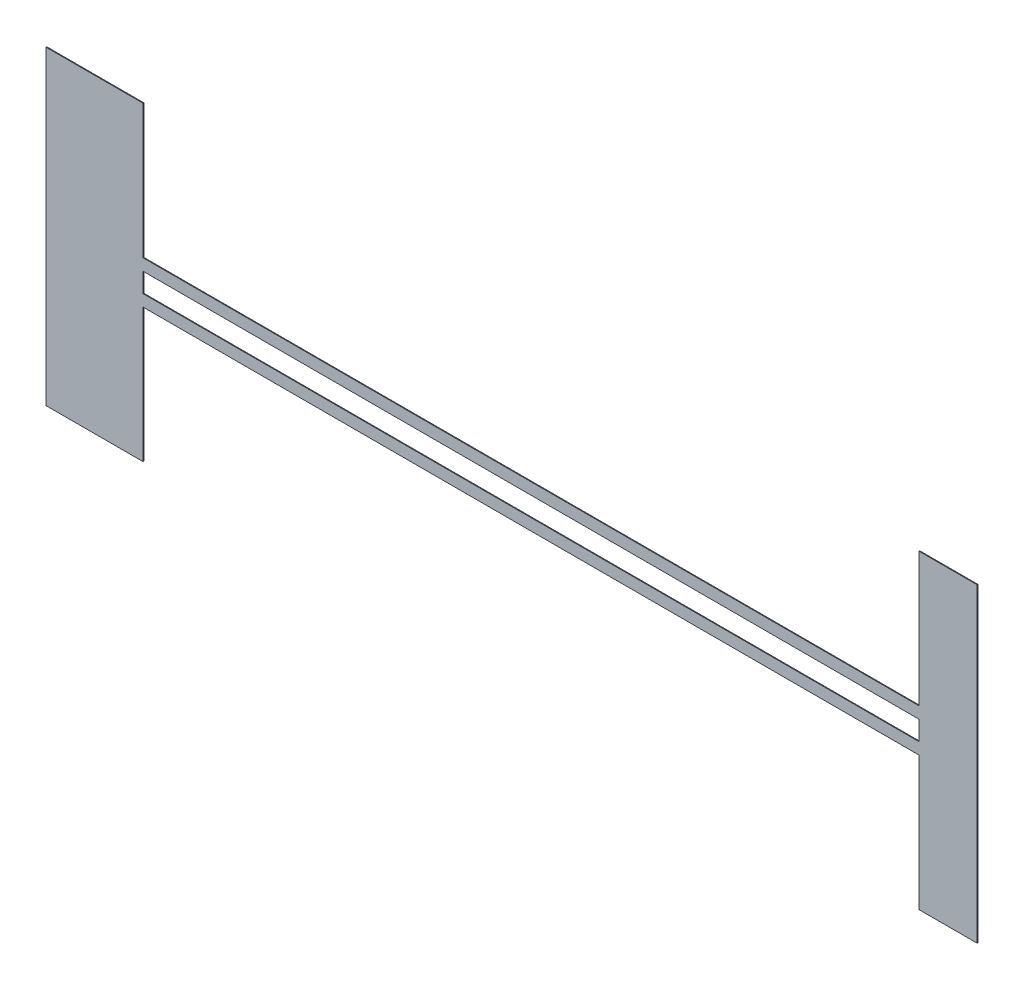
ISO-10303-21;
HEADER;
FILE_DESCRIPTION(('STEP AP214'),'2;1');
FILE_NAME('part.step','',(''),(''),'','','');
FILE_SCHEMA(('AUTOMOTIVE_DESIGN { 1 0 10303 214 1 1 1 1 }'));
ENDSEC;
DATA;
#1=APPLICATION_CONTEXT('core data for automotive mechanical design processes');
#2=APPLICATION_PROTOCOL_DEFINITION('international standard','automotive_design',2000,#1);
#3=PRODUCT_CONTEXT('',#1,'mechanical');
#4=PRODUCT('Part','Part','',(#3));
#5=PRODUCT_RELATED_PRODUCT_CATEGORY('part','',(#4));
#6=PRODUCT_DEFINITION_FORMATION('','',#4);
#7=PRODUCT_DEFINITION_CONTEXT('part definition',#1,'design');
#8=PRODUCT_DEFINITION('design','',#6,#7);
#9=PRODUCT_DEFINITION_SHAPE('','',#8);
#10=(LENGTH_UNIT() NAMED_UNIT(*) SI_UNIT(.MILLI.,.METRE.));
#11=(NAMED_UNIT(*) PLANE_ANGLE_UNIT() SI_UNIT($,.RADIAN.));
#12=(NAMED_UNIT(*) SI_UNIT($,.STERADIAN.) SOLID_ANGLE_UNIT());
#13=UNCERTAINTY_MEASURE_WITH_UNIT(LENGTH_MEASURE(1.E-05),#10,'distance_accuracy_value','');
#14=(GEOMETRIC_REPRESENTATION_CONTEXT(3) GLOBAL_UNCERTAINTY_ASSIGNED_CONTEXT((#13)) GLOBAL_UNIT_ASSIGNED_CONTEXT((#10,
#11,#12)) REPRESENTATION_CONTEXT('',''));
#15=CARTESIAN_POINT('',(0.,0.,0.));
#16=DIRECTION('',(0.,0.,1.));
#17=DIRECTION('',(1.,0.,0.));
#18=AXIS2_PLACEMENT_3D('',#15,#16,#17);
#19=CARTESIAN_POINT('',(-1000.,2000.,-10.));
#20=DIRECTION('',(-1.,0.,0.));
#21=DIRECTION('',(0.,-1.,0.));
#22=AXIS2_PLACEMENT_3D('',#19,#20,#21);
#23=PLANE('',#22);
#24=DIRECTION('',(0.,-1.,0.));
#25=VECTOR('',#24,1.);
#26=CARTESIAN_POINT('',(-1000.,2000.,0.));
#27=LINE('',#26,#25);
#28=CARTESIAN_POINT('',(-1000.,2000.,0.));
#29=VERTEX_POINT('',#28);
#30=CARTESIAN_POINT('',(-1000.,-2000.,0.));
#31=VERTEX_POINT('',#30);
#32=EDGE_CURVE('E185',#29,#31,#27,.T.);
#33=ORIENTED_EDGE('',*,*,#32,.F.);
#34=DIRECTION('',(0.,0.,1.));
#35=VECTOR('',#34,1.);
#36=CARTESIAN_POINT('',(-1000.,2000.,-10.));
#37=LINE('',#36,#35);
#38=CARTESIAN_POINT('',(-1000.,2000.,-10.));
#39=VERTEX_POINT('',#38);
#40=EDGE_CURVE('E11',#39,#29,#37,.T.);
#41=ORIENTED_EDGE('',*,*,#40,.F.);
#42=DIRECTION('',(0.,-1.,0.));
#43=VECTOR('',#42,1.);
#44=CARTESIAN_POINT('',(-1000.,2000.,-10.));
#45=LINE('',#44,#43);
#46=CARTESIAN_POINT('',(-1000.,-2000.,-10.));
#47=VERTEX_POINT('',#46);
#48=EDGE_CURVE('E189',#39,#47,#45,.T.);
#49=ORIENTED_EDGE('',*,*,#48,.T.);
#50=DIRECTION('',(0.,0.,1.));
#51=VECTOR('',#50,1.);
#52=CARTESIAN_POINT('',(-1000.,-2000.,-10.));
#53=LINE('',#52,#51);
#54=EDGE_CURVE('E42',#47,#31,#53,.T.);
#55=ORIENTED_EDGE('',*,*,#54,.T.);
#56=EDGE_LOOP('',(#33,#41,#49,#55));
#57=FACE_BOUND('',#56,.T.);
#58=ADVANCED_FACE('F39',(#57),#23,.T.);
#59=CARTESIAN_POINT('',(-1000.,2000.,-10.));
#60=DIRECTION('',(0.,1.,0.));
#61=DIRECTION('',(0.,0.,1.));
#62=AXIS2_PLACEMENT_3D('',#59,#60,#61);
#63=PLANE('',#62);
#64=DIRECTION('',(-1.,0.,0.));
#65=VECTOR('',#64,1.);
#66=CARTESIAN_POINT('',(-1000.,2000.,0.));
#67=LINE('',#66,#65);
#68=CARTESIAN_POINT('',(250.,2000.,0.));
#69=VERTEX_POINT('',#68);
#70=EDGE_CURVE('E193',#69,#29,#67,.T.);
#71=ORIENTED_EDGE('',*,*,#70,.F.);
#72=DIRECTION('',(0.,0.,1.));
#73=VECTOR('',#72,1.);
#74=CARTESIAN_POINT('',(250.,2000.,-10.));
#75=LINE('',#74,#73);
#76=CARTESIAN_POINT('',(250.,2000.,-10.));
#77=VERTEX_POINT('',#76);
#78=EDGE_CURVE('E47',#77,#69,#75,.T.);
#79=ORIENTED_EDGE('',*,*,#78,.F.);
#80=DIRECTION('',(-1.,0.,0.));
#81=VECTOR('',#80,1.);
#82=CARTESIAN_POINT('',(-1000.,2000.,-10.));
#83=LINE('',#82,#81);
#84=EDGE_CURVE('E223',#77,#39,#83,.T.);
#85=ORIENTED_EDGE('',*,*,#84,.T.);
#86=ORIENTED_EDGE('',*,*,#40,.T.);
#87=EDGE_LOOP('',(#71,#79,#85,#86));
#88=FACE_BOUND('',#87,.T.);
#89=ADVANCED_FACE('F290',(#88),#63,.T.);
#90=CARTESIAN_POINT('',(250.,2000.,-10.));
#91=DIRECTION('',(1.,0.,0.));
#92=DIRECTION('',(0.,1.,0.));
#93=AXIS2_PLACEMENT_3D('',#90,#91,#92);
#94=PLANE('',#93);
#95=DIRECTION('',(0.,1.,0.));
#96=VECTOR('',#95,1.);
#97=CARTESIAN_POINT('',(250.,2000.,0.));
#98=LINE('',#97,#96);
#99=CARTESIAN_POINT('',(250.,275.,0.));
#100=VERTEX_POINT('',#99);
#101=EDGE_CURVE('E255',#100,#69,#98,.T.);
#102=ORIENTED_EDGE('',*,*,#101,.F.);
#103=DIRECTION('',(0.,0.,1.));
#104=VECTOR('',#103,1.);
#105=CARTESIAN_POINT('',(250.,275.,-10.));
#106=LINE('',#105,#104);
#107=CARTESIAN_POINT('',(250.,275.,-10.));
#108=VERTEX_POINT('',#107);
#109=EDGE_CURVE('E261',#108,#100,#106,.T.);
#110=ORIENTED_EDGE('',*,*,#109,.F.);
#111=DIRECTION('',(0.,1.,0.));
#112=VECTOR('',#111,1.);
#113=CARTESIAN_POINT('',(250.,2000.,-10.));
#114=LINE('',#113,#112);
#115=EDGE_CURVE('E220',#108,#77,#114,.T.);
#116=ORIENTED_EDGE('',*,*,#115,.T.);
#117=ORIENTED_EDGE('',*,*,#78,.T.);
#118=EDGE_LOOP('',(#102,#110,#116,#117));
#119=FACE_BOUND('',#118,.T.);
#120=ADVANCED_FACE('F325',(#119),#94,.T.);
#121=CARTESIAN_POINT('',(250.,275.,-10.));
#122=DIRECTION('',(0.,1.,0.));
#123=DIRECTION('',(0.,0.,1.));
#124=AXIS2_PLACEMENT_3D('',#121,#122,#123);
#125=PLANE('',#124);
#126=DIRECTION('',(-1.,0.,0.));
#127=VECTOR('',#126,1.);
#128=CARTESIAN_POINT('',(250.,275.,0.));
#129=LINE('',#128,#127);
#130=CARTESIAN_POINT('',(10250.,275.,0.));
#131=VERTEX_POINT('',#130);
#132=EDGE_CURVE('E252',#131,#100,#129,.T.);
#133=ORIENTED_EDGE('',*,*,#132,.F.);
#134=DIRECTION('',(0.,0.,1.));
#135=VECTOR('',#134,1.);
#136=CARTESIAN_POINT('',(10250.,275.,-10.));
#137=LINE('',#136,#135);
#138=CARTESIAN_POINT('',(10250.,275.,-10.));
#139=VERTEX_POINT('',#138);
#140=EDGE_CURVE('E263',#139,#131,#137,.T.);
#141=ORIENTED_EDGE('',*,*,#140,.F.);
#142=DIRECTION('',(-1.,0.,0.));
#143=VECTOR('',#142,1.);
#144=CARTESIAN_POINT('',(250.,275.,-10.));
#145=LINE('',#144,#143);
#146=EDGE_CURVE('E217',#139,#108,#145,.T.);
#147=ORIENTED_EDGE('',*,*,#146,.T.);
#148=ORIENTED_EDGE('',*,*,#109,.T.);
#149=EDGE_LOOP('',(#133,#141,#147,#148));
#150=FACE_BOUND('',#149,.T.);
#151=ADVANCED_FACE('F322',(#150),#125,.T.);
#152=CARTESIAN_POINT('',(10250.,275.,-10.));
#153=DIRECTION('',(-1.,0.,0.));
#154=DIRECTION('',(0.,0.,1.));
#155=AXIS2_PLACEMENT_3D('',#152,#153,#154);
#156=PLANE('',#155);
#157=DIRECTION('',(0.,-1.,0.));
#158=VECTOR('',#157,1.);
#159=CARTESIAN_POINT('',(10250.,275.,0.));
#160=LINE('',#159,#158);
#161=CARTESIAN_POINT('',(10250.,2000.,0.));
#162=VERTEX_POINT('',#161);
#163=EDGE_CURVE('E249',#162,#131,#160,.T.);
#164=ORIENTED_EDGE('',*,*,#163,.F.);
#165=DIRECTION('',(0.,0.,1.));
#166=VECTOR('',#165,1.);
#167=CARTESIAN_POINT('',(10250.,2000.,-10.));
#168=LINE('',#167,#166);
#169=CARTESIAN_POINT('',(10250.,2000.,-10.));
#170=VERTEX_POINT('',#169);
#171=EDGE_CURVE('E265',#170,#162,#168,.T.);
#172=ORIENTED_EDGE('',*,*,#171,.F.);
#173=DIRECTION('',(0.,-1.,0.));
#174=VECTOR('',#173,1.);
#175=CARTESIAN_POINT('',(10250.,275.,-10.));
#176=LINE('',#175,#174);
#177=EDGE_CURVE('E214',#170,#139,#176,.T.);
#178=ORIENTED_EDGE('',*,*,#177,.T.);
#179=ORIENTED_EDGE('',*,*,#140,.T.);
#180=EDGE_LOOP('',(#164,#172,#178,#179));
#181=FACE_BOUND('',#180,.T.);
#182=ADVANCED_FACE('F319',(#181),#156,.T.);
#183=CARTESIAN_POINT('',(10250.,2000.,-10.));
#184=DIRECTION('',(0.,1.,0.));
#185=DIRECTION('',(0.,0.,1.));
#186=AXIS2_PLACEMENT_3D('',#183,#184,#185);
#187=PLANE('',#186);
#188=DIRECTION('',(-1.,0.,0.));
#189=VECTOR('',#188,1.);
#190=CARTESIAN_POINT('',(10250.,2000.,0.));
#191=LINE('',#190,#189);
#192=CARTESIAN_POINT('',(11000.,2000.,0.));
#193=VERTEX_POINT('',#192);
#194=EDGE_CURVE('E246',#193,#162,#191,.T.);
#195=ORIENTED_EDGE('',*,*,#194,.F.);
#196=DIRECTION('',(0.,0.,1.));
#197=VECTOR('',#196,1.);
#198=CARTESIAN_POINT('',(11000.,2000.,-10.));
#199=LINE('',#198,#197);
#200=CARTESIAN_POINT('',(11000.,2000.,-10.));
#201=VERTEX_POINT('',#200);
#202=EDGE_CURVE('E267',#201,#193,#199,.T.);
#203=ORIENTED_EDGE('',*,*,#202,.F.);
#204=DIRECTION('',(-1.,0.,0.));
#205=VECTOR('',#204,1.);
#206=CARTESIAN_POINT('',(10250.,2000.,-10.));
#207=LINE('',#206,#205);
#208=EDGE_CURVE('E211',#201,#170,#207,.T.);
#209=ORIENTED_EDGE('',*,*,#208,.T.);
#210=ORIENTED_EDGE('',*,*,#171,.T.);
#211=EDGE_LOOP('',(#195,#203,#209,#210));
#212=FACE_BOUND('',#211,.T.);
#213=ADVANCED_FACE('F315',(#212),#187,.T.);
#214=CARTESIAN_POINT('',(11000.,2000.,-10.));
#215=DIRECTION('',(1.,0.,0.));
#216=DIRECTION('',(0.,0.,-1.));
#217=AXIS2_PLACEMENT_3D('',#214,#215,#216);
#218=PLANE('',#217);
#219=DIRECTION('',(0.,1.,0.));
#220=VECTOR('',#219,1.);
#221=CARTESIAN_POINT('',(11000.,2000.,0.));
#222=LINE('',#221,#220);
#223=CARTESIAN_POINT('',(11000.,-2000.,0.));
#224=VERTEX_POINT('',#223);
#225=EDGE_CURVE('E243',#224,#193,#222,.T.);
#226=ORIENTED_EDGE('',*,*,#225,.F.);
#227=DIRECTION('',(0.,0.,1.));
#228=VECTOR('',#227,1.);
#229=CARTESIAN_POINT('',(11000.,-2000.,-10.));
#230=LINE('',#229,#228);
#231=CARTESIAN_POINT('',(11000.,-2000.,-10.));
#232=VERTEX_POINT('',#231);
#233=EDGE_CURVE('E269',#232,#224,#230,.T.);
#234=ORIENTED_EDGE('',*,*,#233,.F.);
#235=DIRECTION('',(0.,1.,0.));
#236=VECTOR('',#235,1.);
#237=CARTESIAN_POINT('',(11000.,2000.,-10.));
#238=LINE('',#237,#236);
#239=EDGE_CURVE('E208',#232,#201,#238,.T.);
#240=ORIENTED_EDGE('',*,*,#239,.T.);
#241=ORIENTED_EDGE('',*,*,#202,.T.);
#242=EDGE_LOOP('',(#226,#234,#240,#241));
#243=FACE_BOUND('',#242,.T.);
#244=ADVANCED_FACE('F311',(#243),#218,.T.);
#245=CARTESIAN_POINT('',(10250.,-2000.,-10.));
#246=DIRECTION('',(0.,-1.,0.));
#247=DIRECTION('',(0.,0.,-1.));
#248=AXIS2_PLACEMENT_3D('',#245,#246,#247);
#249=PLANE('',#248);
#250=DIRECTION('',(1.,0.,0.));
#251=VECTOR('',#250,1.);
#252=CARTESIAN_POINT('',(10250.,-2000.,0.));
#253=LINE('',#252,#251);
#254=CARTESIAN_POINT('',(10250.,-2000.,0.));
#255=VERTEX_POINT('',#254);
#256=EDGE_CURVE('E240',#255,#224,#253,.T.);
#257=ORIENTED_EDGE('',*,*,#256,.F.);
#258=DIRECTION('',(0.,0.,1.));
#259=VECTOR('',#258,1.);
#260=CARTESIAN_POINT('',(10250.,-2000.,-10.));
#261=LINE('',#260,#259);
#262=CARTESIAN_POINT('',(10250.,-2000.,-10.));
#263=VERTEX_POINT('',#262);
#264=EDGE_CURVE('E271',#263,#255,#261,.T.);
#265=ORIENTED_EDGE('',*,*,#264,.F.);
#266=DIRECTION('',(1.,0.,0.));
#267=VECTOR('',#266,1.);
#268=CARTESIAN_POINT('',(10250.,-2000.,-10.));
#269=LINE('',#268,#267);
#270=EDGE_CURVE('E205',#263,#232,#269,.T.);
#271=ORIENTED_EDGE('',*,*,#270,.T.);
#272=ORIENTED_EDGE('',*,*,#233,.T.);
#273=EDGE_LOOP('',(#257,#265,#271,#272));
#274=FACE_BOUND('',#273,.T.);
#275=ADVANCED_FACE('F307',(#274),#249,.T.);
#276=CARTESIAN_POINT('',(10250.,-275.,-10.));
#277=DIRECTION('',(-1.,0.,0.));
#278=DIRECTION('',(0.,0.,1.));
#279=AXIS2_PLACEMENT_3D('',#276,#277,#278);
#280=PLANE('',#279);
#281=DIRECTION('',(0.,-1.,0.));
#282=VECTOR('',#281,1.);
#283=CARTESIAN_POINT('',(10250.,-275.,0.));
#284=LINE('',#283,#282);
#285=CARTESIAN_POINT('',(10250.,-275.,0.));
#286=VERTEX_POINT('',#285);
#287=EDGE_CURVE('E237',#286,#255,#284,.T.);
#288=ORIENTED_EDGE('',*,*,#287,.F.);
#289=DIRECTION('',(0.,0.,1.));
#290=VECTOR('',#289,1.);
#291=CARTESIAN_POINT('',(10250.,-275.,-10.));
#292=LINE('',#291,#290);
#293=CARTESIAN_POINT('',(10250.,-275.,-10.));
#294=VERTEX_POINT('',#293);
#295=EDGE_CURVE('E273',#294,#286,#292,.T.);
#296=ORIENTED_EDGE('',*,*,#295,.F.);
#297=DIRECTION('',(0.,-1.,0.));
#298=VECTOR('',#297,1.);
#299=CARTESIAN_POINT('',(10250.,-275.,-10.));
#300=LINE('',#299,#298);
#301=EDGE_CURVE('E202',#294,#263,#300,.T.);
#302=ORIENTED_EDGE('',*,*,#301,.T.);
#303=ORIENTED_EDGE('',*,*,#264,.T.);
#304=EDGE_LOOP('',(#288,#296,#302,#303));
#305=FACE_BOUND('',#304,.T.);
#306=ADVANCED_FACE('F303',(#305),#280,.T.);
#307=CARTESIAN_POINT('',(250.,-275.,-10.));
#308=DIRECTION('',(0.,-1.,0.));
#309=DIRECTION('',(0.,0.,-1.));
#310=AXIS2_PLACEMENT_3D('',#307,#308,#309);
#311=PLANE('',#310);
#312=DIRECTION('',(1.,0.,0.));
#313=VECTOR('',#312,1.);
#314=CARTESIAN_POINT('',(250.,-275.,0.));
#315=LINE('',#314,#313);
#316=CARTESIAN_POINT('',(250.,-275.,0.));
#317=VERTEX_POINT('',#316);
#318=EDGE_CURVE('E234',#317,#286,#315,.T.);
#319=ORIENTED_EDGE('',*,*,#318,.F.);
#320=DIRECTION('',(0.,0.,1.));
#321=VECTOR('',#320,1.);
#322=CARTESIAN_POINT('',(250.,-275.,-10.));
#323=LINE('',#322,#321);
#324=CARTESIAN_POINT('',(250.,-275.,-10.));
#325=VERTEX_POINT('',#324);
#326=EDGE_CURVE('E275',#325,#317,#323,.T.);
#327=ORIENTED_EDGE('',*,*,#326,.F.);
#328=DIRECTION('',(1.,0.,0.));
#329=VECTOR('',#328,1.);
#330=CARTESIAN_POINT('',(250.,-275.,-10.));
#331=LINE('',#330,#329);
#332=EDGE_CURVE('E199',#325,#294,#331,.T.);
#333=ORIENTED_EDGE('',*,*,#332,.T.);
#334=ORIENTED_EDGE('',*,*,#295,.T.);
#335=EDGE_LOOP('',(#319,#327,#333,#334));
#336=FACE_BOUND('',#335,.T.);
#337=ADVANCED_FACE('F301',(#336),#311,.T.);
#338=CARTESIAN_POINT('',(250.,-2000.,-10.));
#339=DIRECTION('',(1.,0.,0.));
#340=DIRECTION('',(0.,1.,0.));
#341=AXIS2_PLACEMENT_3D('',#338,#339,#340);
#342=PLANE('',#341);
#343=DIRECTION('',(0.,1.,0.));
#344=VECTOR('',#343,1.);
#345=CARTESIAN_POINT('',(250.,-2000.,0.));
#346=LINE('',#345,#344);
#347=CARTESIAN_POINT('',(250.,-2000.,0.));
#348=VERTEX_POINT('',#347);
#349=EDGE_CURVE('E231',#348,#317,#346,.T.);
#350=ORIENTED_EDGE('',*,*,#349,.F.);
#351=DIRECTION('',(0.,0.,1.));
#352=VECTOR('',#351,1.);
#353=CARTESIAN_POINT('',(250.,-2000.,-10.));
#354=LINE('',#353,#352);
#355=CARTESIAN_POINT('',(250.,-2000.,-10.));
#356=VERTEX_POINT('',#355);
#357=EDGE_CURVE('E276',#356,#348,#354,.T.);
#358=ORIENTED_EDGE('',*,*,#357,.F.);
#359=DIRECTION('',(0.,1.,0.));
#360=VECTOR('',#359,1.);
#361=CARTESIAN_POINT('',(250.,-2000.,-10.));
#362=LINE('',#361,#360);
#363=EDGE_CURVE('E196',#356,#325,#362,.T.);
#364=ORIENTED_EDGE('',*,*,#363,.T.);
#365=ORIENTED_EDGE('',*,*,#326,.T.);
#366=EDGE_LOOP('',(#350,#358,#364,#365));
#367=FACE_BOUND('',#366,.T.);
#368=ADVANCED_FACE('F297',(#367),#342,.T.);
#369=CARTESIAN_POINT('',(-1000.,-2000.,-10.));
#370=DIRECTION('',(0.,-1.,0.));
#371=DIRECTION('',(0.,0.,-1.));
#372=AXIS2_PLACEMENT_3D('',#369,#370,#371);
#373=PLANE('',#372);
#374=DIRECTION('',(1.,0.,0.));
#375=VECTOR('',#374,1.);
#376=CARTESIAN_POINT('',(-1000.,-2000.,0.));
#377=LINE('',#376,#375);
#378=EDGE_CURVE('E228',#31,#348,#377,.T.);
#379=ORIENTED_EDGE('',*,*,#378,.F.);
#380=ORIENTED_EDGE('',*,*,#54,.F.);
#381=DIRECTION('',(1.,0.,0.));
#382=VECTOR('',#381,1.);
#383=CARTESIAN_POINT('',(-1000.,-2000.,-10.));
#384=LINE('',#383,#382);
#385=EDGE_CURVE('E192',#47,#356,#384,.T.);
#386=ORIENTED_EDGE('',*,*,#385,.T.);
#387=ORIENTED_EDGE('',*,*,#357,.T.);
#388=EDGE_LOOP('',(#379,#380,#386,#387));
#389=FACE_BOUND('',#388,.T.);
#390=ADVANCED_FACE('F284',(#389),#373,.T.);
#391=CARTESIAN_POINT('',(0.,0.,-10.));
#392=DIRECTION('',(0.,0.,1.));
#393=DIRECTION('',(1.,0.,0.));
#394=AXIS2_PLACEMENT_3D('',#391,#392,#393);
#395=PLANE('',#394);
#396=DIRECTION('',(-1.,0.,0.));
#397=VECTOR('',#396,1.);
#398=CARTESIAN_POINT('',(250.,125.,-10.));
#399=LINE('',#398,#397);
#400=CARTESIAN_POINT('',(10250.,125.,-10.));
#401=VERTEX_POINT('',#400);
#402=CARTESIAN_POINT('',(250.,125.,-10.));
#403=VERTEX_POINT('',#402);
#404=EDGE_CURVE('E160',#401,#403,#399,.T.);
#405=ORIENTED_EDGE('',*,*,#404,.T.);
#406=DIRECTION('',(0.,-1.,0.));
#407=VECTOR('',#406,1.);
#408=CARTESIAN_POINT('',(250.,125.,-10.));
#409=LINE('',#408,#407);
#410=CARTESIAN_POINT('',(250.,-125.,-10.));
#411=VERTEX_POINT('',#410);
#412=EDGE_CURVE('E154',#403,#411,#409,.T.);
#413=ORIENTED_EDGE('',*,*,#412,.T.);
#414=DIRECTION('',(1.,0.,0.));
#415=VECTOR('',#414,1.);
#416=CARTESIAN_POINT('',(250.,-125.,-10.));
#417=LINE('',#416,#415);
#418=CARTESIAN_POINT('',(10250.,-125.,-10.));
#419=VERTEX_POINT('',#418);
#420=EDGE_CURVE('E163',#411,#419,#417,.T.);
#421=ORIENTED_EDGE('',*,*,#420,.T.);
#422=DIRECTION('',(0.,1.,0.));
#423=VECTOR('',#422,1.);
#424=CARTESIAN_POINT('',(10250.,125.,-10.));
#425=LINE('',#424,#423);
#426=EDGE_CURVE('E55',#419,#401,#425,.T.);
#427=ORIENTED_EDGE('',*,*,#426,.T.);
#428=EDGE_LOOP('',(#405,#413,#421,#427));
#429=FACE_BOUND('',#428,.T.);
#430=ORIENTED_EDGE('',*,*,#48,.F.);
#431=ORIENTED_EDGE('',*,*,#84,.F.);
#432=ORIENTED_EDGE('',*,*,#115,.F.);
#433=ORIENTED_EDGE('',*,*,#146,.F.);
#434=ORIENTED_EDGE('',*,*,#177,.F.);
#435=ORIENTED_EDGE('',*,*,#208,.F.);
#436=ORIENTED_EDGE('',*,*,#239,.F.);
#437=ORIENTED_EDGE('',*,*,#270,.F.);
#438=ORIENTED_EDGE('',*,*,#301,.F.);
#439=ORIENTED_EDGE('',*,*,#332,.F.);
#440=ORIENTED_EDGE('',*,*,#363,.F.);
#441=ORIENTED_EDGE('',*,*,#385,.F.);
#442=EDGE_LOOP('',(#430,#431,#432,#433,#434,#435,#436,#437,#438,#439,#440,#441));
#443=FACE_BOUND('',#442,.T.);
#444=ADVANCED_FACE('F167',(#429,#443),#395,.F.);
#445=CARTESIAN_POINT('',(0.,0.,0.));
#446=DIRECTION('',(0.,0.,1.));
#447=DIRECTION('',(1.,0.,0.));
#448=AXIS2_PLACEMENT_3D('',#445,#446,#447);
#449=PLANE('',#448);
#450=DIRECTION('',(0.,-1.,0.));
#451=VECTOR('',#450,1.);
#452=CARTESIAN_POINT('',(250.,125.,0.));
#453=LINE('',#452,#451);
#454=CARTESIAN_POINT('',(250.,125.,0.));
#455=VERTEX_POINT('',#454);
#456=CARTESIAN_POINT('',(250.,-125.,0.));
#457=VERTEX_POINT('',#456);
#458=EDGE_CURVE('E63',#455,#457,#453,.T.);
#459=ORIENTED_EDGE('',*,*,#458,.F.);
#460=DIRECTION('',(-1.,0.,0.));
#461=VECTOR('',#460,1.);
#462=CARTESIAN_POINT('',(250.,125.,0.));
#463=LINE('',#462,#461);
#464=CARTESIAN_POINT('',(10250.,125.,0.));
#465=VERTEX_POINT('',#464);
#466=EDGE_CURVE('E170',#465,#455,#463,.T.);
#467=ORIENTED_EDGE('',*,*,#466,.F.);
#468=DIRECTION('',(0.,1.,0.));
#469=VECTOR('',#468,1.);
#470=CARTESIAN_POINT('',(10250.,125.,0.));
#471=LINE('',#470,#469);
#472=CARTESIAN_POINT('',(10250.,-125.,0.));
#473=VERTEX_POINT('',#472);
#474=EDGE_CURVE('E173',#473,#465,#471,.T.);
#475=ORIENTED_EDGE('',*,*,#474,.F.);
#476=DIRECTION('',(1.,0.,0.));
#477=VECTOR('',#476,1.);
#478=CARTESIAN_POINT('',(250.,-125.,0.));
#479=LINE('',#478,#477);
#480=EDGE_CURVE('E179',#457,#473,#479,.T.);
#481=ORIENTED_EDGE('',*,*,#480,.F.);
#482=EDGE_LOOP('',(#459,#467,#475,#481));
#483=FACE_BOUND('',#482,.T.);
#484=ORIENTED_EDGE('',*,*,#32,.T.);
#485=ORIENTED_EDGE('',*,*,#378,.T.);
#486=ORIENTED_EDGE('',*,*,#349,.T.);
#487=ORIENTED_EDGE('',*,*,#318,.T.);
#488=ORIENTED_EDGE('',*,*,#287,.T.);
#489=ORIENTED_EDGE('',*,*,#256,.T.);
#490=ORIENTED_EDGE('',*,*,#225,.T.);
#491=ORIENTED_EDGE('',*,*,#194,.T.);
#492=ORIENTED_EDGE('',*,*,#163,.T.);
#493=ORIENTED_EDGE('',*,*,#132,.T.);
#494=ORIENTED_EDGE('',*,*,#101,.T.);
#495=ORIENTED_EDGE('',*,*,#70,.T.);
#496=EDGE_LOOP('',(#484,#485,#486,#487,#488,#489,#490,#491,#492,#493,#494,#495));
#497=FACE_BOUND('',#496,.T.);
#498=ADVANCED_FACE('F286',(#483,#497),#449,.T.);
#499=CARTESIAN_POINT('',(250.,125.,-10.));
#500=DIRECTION('',(-1.,0.,0.));
#501=DIRECTION('',(0.,0.,1.));
#502=AXIS2_PLACEMENT_3D('',#499,#500,#501);
#503=PLANE('',#502);
#504=ORIENTED_EDGE('',*,*,#458,.T.);
#505=DIRECTION('',(0.,0.,1.));
#506=VECTOR('',#505,1.);
#507=CARTESIAN_POINT('',(250.,-125.,-10.));
#508=LINE('',#507,#506);
#509=EDGE_CURVE('E150',#411,#457,#508,.T.);
#510=ORIENTED_EDGE('',*,*,#509,.F.);
#511=ORIENTED_EDGE('',*,*,#412,.F.);
#512=DIRECTION('',(0.,0.,1.));
#513=VECTOR('',#512,1.);
#514=CARTESIAN_POINT('',(250.,125.,-10.));
#515=LINE('',#514,#513);
#516=EDGE_CURVE('E183',#403,#455,#515,.T.);
#517=ORIENTED_EDGE('',*,*,#516,.T.);
#518=EDGE_LOOP('',(#504,#510,#511,#517));
#519=FACE_BOUND('',#518,.T.);
#520=ADVANCED_FACE('F152',(#519),#503,.F.);
#521=CARTESIAN_POINT('',(250.,125.,-10.));
#522=DIRECTION('',(0.,1.,0.));
#523=DIRECTION('',(0.,0.,1.));
#524=AXIS2_PLACEMENT_3D('',#521,#522,#523);
#525=PLANE('',#524);
#526=ORIENTED_EDGE('',*,*,#466,.T.);
#527=ORIENTED_EDGE('',*,*,#516,.F.);
#528=ORIENTED_EDGE('',*,*,#404,.F.);
#529=DIRECTION('',(0.,0.,1.));
#530=VECTOR('',#529,1.);
#531=CARTESIAN_POINT('',(10250.,125.,-10.));
#532=LINE('',#531,#530);
#533=EDGE_CURVE('E186',#401,#465,#532,.T.);
#534=ORIENTED_EDGE('',*,*,#533,.T.);
#535=EDGE_LOOP('',(#526,#527,#528,#534));
#536=FACE_BOUND('',#535,.T.);
#537=ADVANCED_FACE('F453',(#536),#525,.F.);
#538=CARTESIAN_POINT('',(10250.,125.,-10.));
#539=DIRECTION('',(1.,0.,0.));
#540=DIRECTION('',(0.,0.,-1.));
#541=AXIS2_PLACEMENT_3D('',#538,#539,#540);
#542=PLANE('',#541);
#543=ORIENTED_EDGE('',*,*,#474,.T.);
#544=ORIENTED_EDGE('',*,*,#533,.F.);
#545=ORIENTED_EDGE('',*,*,#426,.F.);
#546=DIRECTION('',(0.,0.,1.));
#547=VECTOR('',#546,1.);
#548=CARTESIAN_POINT('',(10250.,-125.,-10.));
#549=LINE('',#548,#547);
#550=EDGE_CURVE('E159',#419,#473,#549,.T.);
#551=ORIENTED_EDGE('',*,*,#550,.T.);
#552=EDGE_LOOP('',(#543,#544,#545,#551));
#553=FACE_BOUND('',#552,.T.);
#554=ADVANCED_FACE('F463',(#553),#542,.F.);
#555=CARTESIAN_POINT('',(250.,-125.,-10.));
#556=DIRECTION('',(0.,-1.,0.));
#557=DIRECTION('',(0.,0.,-1.));
#558=AXIS2_PLACEMENT_3D('',#555,#556,#557);
#559=PLANE('',#558);
#560=ORIENTED_EDGE('',*,*,#480,.T.);
#561=ORIENTED_EDGE('',*,*,#550,.F.);
#562=ORIENTED_EDGE('',*,*,#420,.F.);
#563=ORIENTED_EDGE('',*,*,#509,.T.);
#564=EDGE_LOOP('',(#560,#561,#562,#563));
#565=FACE_BOUND('',#564,.T.);
#566=ADVANCED_FACE('F164',(#565),#559,.F.);
#567=CLOSED_SHELL('',(#58,#89,#120,#151,#182,#213,#244,#275,#306,#337,#368,#390,#444,#498,#520,
#537,#554,#566));
#568=MANIFOLD_SOLID_BREP('B2',#567);
#569=ADVANCED_BREP_SHAPE_REPRESENTATION('',(#18,#568),#14);
#570=SHAPE_DEFINITION_REPRESENTATION(#9,#569);
ENDSEC;
END-ISO-10303-21;
